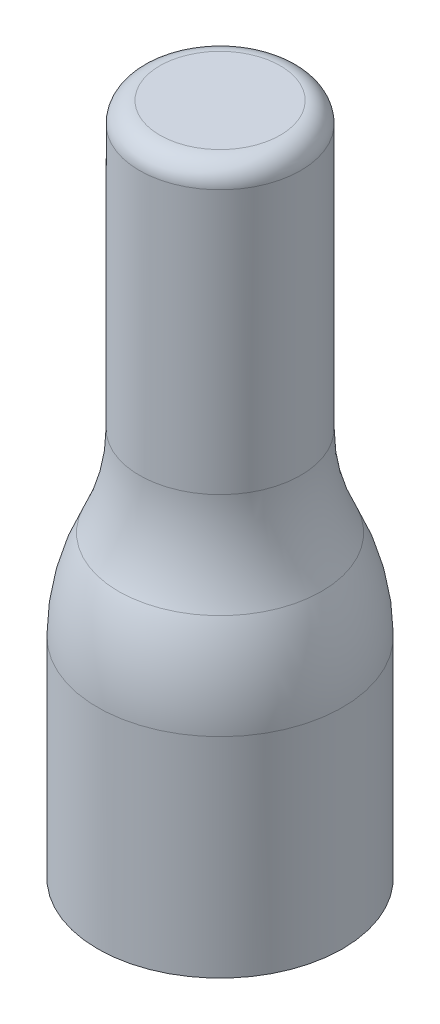
ISO-10303-21;
HEADER;
FILE_DESCRIPTION(('STEP AP214'),'2;1');
FILE_NAME('part.step','',(''),(''),'','','');
FILE_SCHEMA(('AUTOMOTIVE_DESIGN { 1 0 10303 214 1 1 1 1 }'));
ENDSEC;
DATA;
#1=APPLICATION_CONTEXT('core data for automotive mechanical design processes');
#2=APPLICATION_PROTOCOL_DEFINITION('international standard','automotive_design',2000,#1);
#3=PRODUCT_CONTEXT('',#1,'mechanical');
#4=PRODUCT('Part','Part','',(#3));
#5=PRODUCT_RELATED_PRODUCT_CATEGORY('part','',(#4));
#6=PRODUCT_DEFINITION_FORMATION('','',#4);
#7=PRODUCT_DEFINITION_CONTEXT('part definition',#1,'design');
#8=PRODUCT_DEFINITION('design','',#6,#7);
#9=PRODUCT_DEFINITION_SHAPE('','',#8);
#10=(LENGTH_UNIT() NAMED_UNIT(*) SI_UNIT(.MILLI.,.METRE.));
#11=(NAMED_UNIT(*) PLANE_ANGLE_UNIT() SI_UNIT($,.RADIAN.));
#12=(NAMED_UNIT(*) SI_UNIT($,.STERADIAN.) SOLID_ANGLE_UNIT());
#13=UNCERTAINTY_MEASURE_WITH_UNIT(LENGTH_MEASURE(1.E-05),#10,'distance_accuracy_value','');
#14=(GEOMETRIC_REPRESENTATION_CONTEXT(3) GLOBAL_UNCERTAINTY_ASSIGNED_CONTEXT((#13)) GLOBAL_UNIT_ASSIGNED_CONTEXT((#10,
#11,#12)) REPRESENTATION_CONTEXT('',''));
#15=CARTESIAN_POINT('',(0.,0.,0.));
#16=DIRECTION('',(0.,0.,1.));
#17=DIRECTION('',(1.,0.,0.));
#18=AXIS2_PLACEMENT_3D('',#15,#16,#17);
#19=CARTESIAN_POINT('',(0.,0.,0.));
#20=DIRECTION('',(0.,1.,0.));
#21=DIRECTION('',(0.,0.,1.));
#22=AXIS2_PLACEMENT_3D('',#19,#20,#21);
#23=PLANE('',#22);
#24=CARTESIAN_POINT('',(0.,0.,0.));
#25=DIRECTION('',(0.,1.,0.));
#26=DIRECTION('',(0.,0.,1.));
#27=AXIS2_PLACEMENT_3D('',#24,#25,#26);
#28=CIRCLE('',#27,5.);
#29=CARTESIAN_POINT('',(0.,0.,5.));
#30=VERTEX_POINT('',#29);
#31=EDGE_CURVE('E46',#30,#30,#28,.T.);
#32=ORIENTED_EDGE('',*,*,#31,.T.);
#33=EDGE_LOOP('',(#32));
#34=FACE_BOUND('',#33,.T.);
#35=CARTESIAN_POINT('',(0.,0.,0.));
#36=DIRECTION('',(0.,1.,0.));
#37=DIRECTION('',(0.,0.,1.));
#38=AXIS2_PLACEMENT_3D('',#35,#36,#37);
#39=CIRCLE('',#38,6.);
#40=CARTESIAN_POINT('',(0.,0.,6.));
#41=VERTEX_POINT('',#40);
#42=EDGE_CURVE('E60',#41,#41,#39,.T.);
#43=ORIENTED_EDGE('',*,*,#42,.F.);
#44=EDGE_LOOP('',(#43));
#45=FACE_BOUND('',#44,.T.);
#46=ADVANCED_FACE('F31',(#34,#45),#23,.F.);
#47=CARTESIAN_POINT('',(0.,10.,0.));
#48=DIRECTION('',(0.,-1.,0.));
#49=DIRECTION('',(0.,0.,-1.));
#50=AXIS2_PLACEMENT_3D('',#47,#48,#49);
#51=CYLINDRICAL_SURFACE('',#50,6.);
#52=CARTESIAN_POINT('',(0.,10.2458051844357,0.));
#53=DIRECTION('',(0.,-1.,0.));
#54=DIRECTION('',(0.,0.,-1.));
#55=AXIS2_PLACEMENT_3D('',#52,#53,#54);
#56=CIRCLE('',#55,6.);
#57=CARTESIAN_POINT('',(0.,10.2458051844357,-6.));
#58=VERTEX_POINT('',#57);
#59=EDGE_CURVE('E10',#58,#58,#56,.T.);
#60=ORIENTED_EDGE('',*,*,#59,.T.);
#61=EDGE_LOOP('',(#60));
#62=FACE_BOUND('',#61,.T.);
#63=ORIENTED_EDGE('',*,*,#42,.T.);
#64=EDGE_LOOP('',(#63));
#65=FACE_BOUND('',#64,.T.);
#66=ADVANCED_FACE('F80',(#62,#65),#51,.T.);
#67=CARTESIAN_POINT('',(0.,10.,0.));
#68=DIRECTION('',(0.,-1.,0.));
#69=DIRECTION('',(0.,0.,-1.));
#70=AXIS2_PLACEMENT_3D('',#67,#68,#69);
#71=CYLINDRICAL_SURFACE('',#70,4.);
#72=CARTESIAN_POINT('',(0.,0.999999999999999,0.));
#73=DIRECTION('',(0.,1.,0.));
#74=DIRECTION('',(0.,0.,1.));
#75=AXIS2_PLACEMENT_3D('',#72,#73,#74);
#76=CIRCLE('',#75,4.);
#77=CARTESIAN_POINT('',(0.,0.999999999999999,4.));
#78=VERTEX_POINT('',#77);
#79=EDGE_CURVE('E42',#78,#78,#76,.F.);
#80=ORIENTED_EDGE('',*,*,#79,.T.);
#81=EDGE_LOOP('',(#80));
#82=FACE_BOUND('',#81,.T.);
#83=CARTESIAN_POINT('',(0.,10.,0.));
#84=DIRECTION('',(0.,1.,0.));
#85=DIRECTION('',(0.,0.,1.));
#86=AXIS2_PLACEMENT_3D('',#83,#84,#85);
#87=CIRCLE('',#86,4.);
#88=CARTESIAN_POINT('',(0.,10.,4.));
#89=VERTEX_POINT('',#88);
#90=EDGE_CURVE('E63',#89,#89,#87,.T.);
#91=ORIENTED_EDGE('',*,*,#90,.T.);
#92=EDGE_LOOP('',(#91));
#93=FACE_BOUND('',#92,.T.);
#94=ADVANCED_FACE('F67',(#82,#93),#71,.F.);
#95=CARTESIAN_POINT('',(0.,10.,0.));
#96=DIRECTION('',(0.,1.,0.));
#97=DIRECTION('',(0.,0.,1.));
#98=AXIS2_PLACEMENT_3D('',#95,#96,#97);
#99=PLANE('',#98);
#100=ORIENTED_EDGE('',*,*,#90,.F.);
#101=EDGE_LOOP('',(#100));
#102=FACE_BOUND('',#101,.T.);
#103=ADVANCED_FACE('F69',(#102),#99,.F.);
#104=CARTESIAN_POINT('',(0.,33.,0.));
#105=DIRECTION('',(0.,-1.,0.));
#106=DIRECTION('',(0.,0.,-1.));
#107=AXIS2_PLACEMENT_3D('',#104,#105,#106);
#108=CYLINDRICAL_SURFACE('',#107,3.95);
#109=CARTESIAN_POINT('',(0.,19.0660942953436,0.));
#110=DIRECTION('',(0.,-1.,0.));
#111=DIRECTION('',(0.,0.,-1.));
#112=AXIS2_PLACEMENT_3D('',#109,#110,#111);
#113=CIRCLE('',#112,3.95);
#114=CARTESIAN_POINT('',(0.,19.0660942953436,-3.95));
#115=VERTEX_POINT('',#114);
#116=EDGE_CURVE('E51',#115,#115,#113,.F.);
#117=ORIENTED_EDGE('',*,*,#116,.T.);
#118=EDGE_LOOP('',(#117));
#119=FACE_BOUND('',#118,.T.);
#120=CARTESIAN_POINT('',(0.,32.,0.));
#121=DIRECTION('',(0.,1.,0.));
#122=DIRECTION('',(0.,0.,1.));
#123=AXIS2_PLACEMENT_3D('',#120,#121,#122);
#124=CIRCLE('',#123,3.95);
#125=CARTESIAN_POINT('',(0.,32.,3.95));
#126=VERTEX_POINT('',#125);
#127=EDGE_CURVE('E54',#126,#126,#124,.F.);
#128=ORIENTED_EDGE('',*,*,#127,.T.);
#129=EDGE_LOOP('',(#128));
#130=FACE_BOUND('',#129,.T.);
#131=ADVANCED_FACE('F71',(#119,#130),#108,.T.);
#132=CARTESIAN_POINT('',(0.,33.,0.));
#133=DIRECTION('',(0.,1.,0.));
#134=DIRECTION('',(0.,0.,1.));
#135=AXIS2_PLACEMENT_3D('',#132,#133,#134);
#136=PLANE('',#135);
#137=CARTESIAN_POINT('',(0.,33.,0.));
#138=DIRECTION('',(0.,1.,0.));
#139=DIRECTION('',(0.,0.,1.));
#140=AXIS2_PLACEMENT_3D('',#137,#138,#139);
#141=CIRCLE('',#140,2.95);
#142=CARTESIAN_POINT('',(0.,33.,2.95));
#143=VERTEX_POINT('',#142);
#144=EDGE_CURVE('E57',#143,#143,#141,.T.);
#145=ORIENTED_EDGE('',*,*,#144,.T.);
#146=EDGE_LOOP('',(#145));
#147=FACE_BOUND('',#146,.T.);
#148=ADVANCED_FACE('F77',(#147),#136,.T.);
#149=CARTESIAN_POINT('',(0.,32.,0.));
#150=DIRECTION('',(0.,1.,0.));
#151=DIRECTION('',(0.,0.,1.));
#152=AXIS2_PLACEMENT_3D('',#149,#150,#151);
#153=TOROIDAL_SURFACE('',#152,2.95,1.);
#154=ORIENTED_EDGE('',*,*,#127,.F.);
#155=EDGE_LOOP('',(#154));
#156=FACE_BOUND('',#155,.T.);
#157=ORIENTED_EDGE('',*,*,#144,.F.);
#158=EDGE_LOOP('',(#157));
#159=FACE_BOUND('',#158,.T.);
#160=ADVANCED_FACE('F92',(#156,#159),#153,.T.);
#161=CARTESIAN_POINT('',(0.,19.0660942953436,0.));
#162=DIRECTION('',(0.,-1.,0.));
#163=DIRECTION('',(0.,0.,-1.));
#164=AXIS2_PLACEMENT_3D('',#161,#162,#163);
#165=TOROIDAL_SURFACE('',#164,13.95,10.);
#166=CARTESIAN_POINT('',(0.,14.6559497398896,0.));
#167=DIRECTION('',(0.,1.,0.));
#168=DIRECTION('',(0.,0.,1.));
#169=AXIS2_PLACEMENT_3D('',#166,#167,#168);
#170=CIRCLE('',#169,4.975);
#171=CARTESIAN_POINT('',(0.,14.6559497398896,4.975));
#172=VERTEX_POINT('',#171);
#173=EDGE_CURVE('E38',#172,#172,#170,.T.);
#174=ORIENTED_EDGE('',*,*,#173,.T.);
#175=EDGE_LOOP('',(#174));
#176=FACE_BOUND('',#175,.T.);
#177=ORIENTED_EDGE('',*,*,#116,.F.);
#178=EDGE_LOOP('',(#177));
#179=FACE_BOUND('',#178,.T.);
#180=ADVANCED_FACE('F95',(#176,#179),#165,.F.);
#181=CARTESIAN_POINT('',(0.,0.999999999999999,0.));
#182=DIRECTION('',(0.,1.,0.));
#183=DIRECTION('',(0.,0.,1.));
#184=AXIS2_PLACEMENT_3D('',#181,#182,#183);
#185=TOROIDAL_SURFACE('',#184,5.,1.);
#186=ORIENTED_EDGE('',*,*,#79,.F.);
#187=EDGE_LOOP('',(#186));
#188=FACE_BOUND('',#187,.T.);
#189=ORIENTED_EDGE('',*,*,#31,.F.);
#190=EDGE_LOOP('',(#189));
#191=FACE_BOUND('',#190,.T.);
#192=ADVANCED_FACE('F98',(#188,#191),#185,.T.);
#193=CARTESIAN_POINT('',(0.,10.2458051844357,0.));
#194=DIRECTION('',(0.,-1.,0.));
#195=DIRECTION('',(0.,0.,-1.));
#196=AXIS2_PLACEMENT_3D('',#193,#194,#195);
#197=DEGENERATE_TOROIDAL_SURFACE('',#196,4.,10.,.F.);
#198=ORIENTED_EDGE('',*,*,#59,.F.);
#199=EDGE_LOOP('',(#198));
#200=FACE_BOUND('',#199,.T.);
#201=ORIENTED_EDGE('',*,*,#173,.F.);
#202=EDGE_LOOP('',(#201));
#203=FACE_BOUND('',#202,.T.);
#204=ADVANCED_FACE('F33',(#200,#203),#197,.F.);
#205=CLOSED_SHELL('',(#46,#66,#94,#103,#131,#148,#160,#180,#192,#204));
#206=MANIFOLD_SOLID_BREP('B2',#205);
#207=ADVANCED_BREP_SHAPE_REPRESENTATION('',(#18,#206),#14);
#208=SHAPE_DEFINITION_REPRESENTATION(#9,#207);
ENDSEC;
END-ISO-10303-21;
